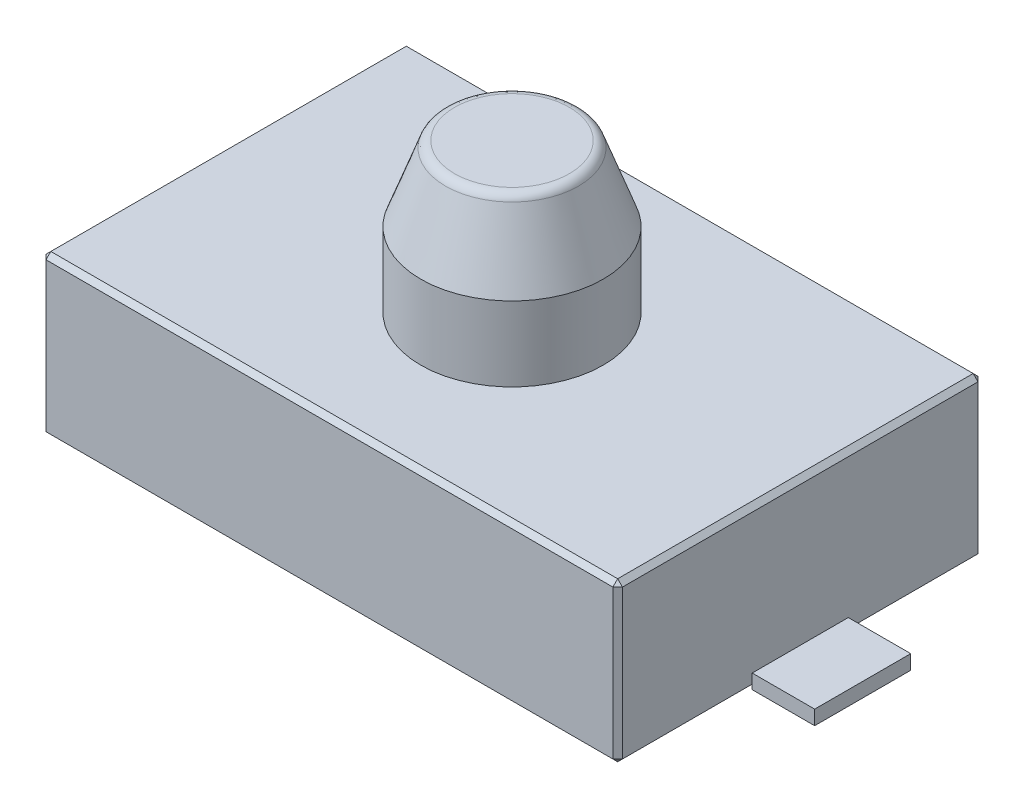
ISO-10303-21;
HEADER;
FILE_DESCRIPTION(('STEP AP214'),'2;1');
FILE_NAME('part.step','',(''),(''),'','','');
FILE_SCHEMA(('AUTOMOTIVE_DESIGN { 1 0 10303 214 1 1 1 1 }'));
ENDSEC;
DATA;
#1=APPLICATION_CONTEXT('core data for automotive mechanical design processes');
#2=APPLICATION_PROTOCOL_DEFINITION('international standard','automotive_design',2000,#1);
#3=PRODUCT_CONTEXT('',#1,'mechanical');
#4=PRODUCT('Part','Part','',(#3));
#5=PRODUCT_RELATED_PRODUCT_CATEGORY('part','',(#4));
#6=PRODUCT_DEFINITION_FORMATION('','',#4);
#7=PRODUCT_DEFINITION_CONTEXT('part definition',#1,'design');
#8=PRODUCT_DEFINITION('design','',#6,#7);
#9=PRODUCT_DEFINITION_SHAPE('','',#8);
#10=(LENGTH_UNIT() NAMED_UNIT(*) SI_UNIT(.MILLI.,.METRE.));
#11=(NAMED_UNIT(*) PLANE_ANGLE_UNIT() SI_UNIT($,.RADIAN.));
#12=(NAMED_UNIT(*) SI_UNIT($,.STERADIAN.) SOLID_ANGLE_UNIT());
#13=UNCERTAINTY_MEASURE_WITH_UNIT(LENGTH_MEASURE(1.E-05),#10,'distance_accuracy_value','');
#14=(GEOMETRIC_REPRESENTATION_CONTEXT(3) GLOBAL_UNCERTAINTY_ASSIGNED_CONTEXT((#13)) GLOBAL_UNIT_ASSIGNED_CONTEXT((#10,
#11,#12)) REPRESENTATION_CONTEXT('',''));
#15=CARTESIAN_POINT('',(0.,0.,0.));
#16=DIRECTION('',(0.,0.,1.));
#17=DIRECTION('',(1.,0.,0.));
#18=AXIS2_PLACEMENT_3D('',#15,#16,#17);
#19=CARTESIAN_POINT('',(-1.54994083130457,2.425,1.67597402597403));
#20=DIRECTION('',(0.,-1.,0.));
#21=DIRECTION('',(0.,0.,-1.));
#22=AXIS2_PLACEMENT_3D('',#19,#20,#21);
#23=CYLINDRICAL_SURFACE('',#22,0.95);
#24=CARTESIAN_POINT('',(-1.54994083130457,2.425,1.67597402597403));
#25=DIRECTION('',(0.,1.,0.));
#26=DIRECTION('',(0.,0.,1.));
#27=AXIS2_PLACEMENT_3D('',#24,#25,#26);
#28=CIRCLE('',#27,0.95);
#29=CARTESIAN_POINT('',(-1.54994083130457,2.425,0.725974025974026));
#30=VERTEX_POINT('',#29);
#31=EDGE_CURVE('E72',#30,#30,#28,.T.);
#32=CARTESIAN_POINT('',(-1.54994083130457,1.65,1.67597402597403));
#33=DIRECTION('',(0.,1.,0.));
#34=DIRECTION('',(0.,0.,1.));
#35=AXIS2_PLACEMENT_3D('',#32,#33,#34);
#36=CIRCLE('',#35,0.95);
#37=CARTESIAN_POINT('',(-1.54994083130457,1.65,0.725974025974026));
#38=VERTEX_POINT('',#37);
#39=EDGE_CURVE('E76',#38,#38,#36,.T.);
#40=CARTESIAN_POINT('',(-1.54994083130457,2.425,0.725974025974026));
#41=CARTESIAN_POINT('',(-1.54994083130457,2.41692708333333,0.725974025974026));
#42=CARTESIAN_POINT('',(-1.54994083130457,2.40885416666667,0.725974025974026));
#43=CARTESIAN_POINT('',(-1.54994083130457,2.39270833333333,0.725974025974026));
#44=CARTESIAN_POINT('',(-1.54994083130457,2.38463541666667,0.725974025974026));
#45=CARTESIAN_POINT('',(-1.54994083130457,2.36848958333333,0.725974025974026));
#46=CARTESIAN_POINT('',(-1.54994083130457,2.36041666666667,0.725974025974026));
#47=CARTESIAN_POINT('',(-1.54994083130457,2.34427083333333,0.725974025974026));
#48=CARTESIAN_POINT('',(-1.54994083130457,2.33619791666667,0.725974025974026));
#49=CARTESIAN_POINT('',(-1.54994083130457,2.32005208333333,0.725974025974026));
#50=CARTESIAN_POINT('',(-1.54994083130457,2.31197916666667,0.725974025974026));
#51=CARTESIAN_POINT('',(-1.54994083130457,2.29583333333333,0.725974025974026));
#52=CARTESIAN_POINT('',(-1.54994083130457,2.28776041666667,0.725974025974026));
#53=CARTESIAN_POINT('',(-1.54994083130457,2.27161458333333,0.725974025974026));
#54=CARTESIAN_POINT('',(-1.54994083130457,2.26354166666667,0.725974025974026));
#55=CARTESIAN_POINT('',(-1.54994083130457,2.24739583333333,0.725974025974026));
#56=CARTESIAN_POINT('',(-1.54994083130457,2.23932291666667,0.725974025974026));
#57=CARTESIAN_POINT('',(-1.54994083130457,2.22317708333333,0.725974025974026));
#58=CARTESIAN_POINT('',(-1.54994083130457,2.21510416666667,0.725974025974026));
#59=CARTESIAN_POINT('',(-1.54994083130457,2.19895833333333,0.725974025974026));
#60=CARTESIAN_POINT('',(-1.54994083130457,2.19088541666667,0.725974025974026));
#61=CARTESIAN_POINT('',(-1.54994083130457,2.17473958333333,0.725974025974026));
#62=CARTESIAN_POINT('',(-1.54994083130457,2.16666666666667,0.725974025974026));
#63=CARTESIAN_POINT('',(-1.54994083130457,2.15052083333333,0.725974025974026));
#64=CARTESIAN_POINT('',(-1.54994083130457,2.14244791666667,0.725974025974026));
#65=CARTESIAN_POINT('',(-1.54994083130457,2.12630208333333,0.725974025974026));
#66=CARTESIAN_POINT('',(-1.54994083130457,2.11822916666667,0.725974025974026));
#67=CARTESIAN_POINT('',(-1.54994083130457,2.10208333333333,0.725974025974026));
#68=CARTESIAN_POINT('',(-1.54994083130457,2.09401041666667,0.725974025974026));
#69=CARTESIAN_POINT('',(-1.54994083130457,2.07786458333333,0.725974025974026));
#70=CARTESIAN_POINT('',(-1.54994083130457,2.06979166666667,0.725974025974026));
#71=CARTESIAN_POINT('',(-1.54994083130457,2.05364583333333,0.725974025974026));
#72=CARTESIAN_POINT('',(-1.54994083130457,2.04557291666667,0.725974025974026));
#73=CARTESIAN_POINT('',(-1.54994083130457,2.02942708333333,0.725974025974026));
#74=CARTESIAN_POINT('',(-1.54994083130457,2.02135416666667,0.725974025974026));
#75=CARTESIAN_POINT('',(-1.54994083130457,2.00520833333333,0.725974025974026));
#76=CARTESIAN_POINT('',(-1.54994083130457,1.99713541666667,0.725974025974026));
#77=CARTESIAN_POINT('',(-1.54994083130457,1.98098958333333,0.725974025974026));
#78=CARTESIAN_POINT('',(-1.54994083130457,1.97291666666667,0.725974025974026));
#79=CARTESIAN_POINT('',(-1.54994083130457,1.95677083333333,0.725974025974026));
#80=CARTESIAN_POINT('',(-1.54994083130457,1.94869791666667,0.725974025974026));
#81=CARTESIAN_POINT('',(-1.54994083130457,1.93255208333333,0.725974025974026));
#82=CARTESIAN_POINT('',(-1.54994083130457,1.92447916666667,0.725974025974026));
#83=CARTESIAN_POINT('',(-1.54994083130457,1.90833333333333,0.725974025974026));
#84=CARTESIAN_POINT('',(-1.54994083130457,1.90026041666667,0.725974025974026));
#85=CARTESIAN_POINT('',(-1.54994083130457,1.88411458333333,0.725974025974026));
#86=CARTESIAN_POINT('',(-1.54994083130457,1.87604166666667,0.725974025974026));
#87=CARTESIAN_POINT('',(-1.54994083130457,1.85989583333333,0.725974025974026));
#88=CARTESIAN_POINT('',(-1.54994083130457,1.85182291666667,0.725974025974026));
#89=CARTESIAN_POINT('',(-1.54994083130457,1.83567708333333,0.725974025974026));
#90=CARTESIAN_POINT('',(-1.54994083130457,1.82760416666667,0.725974025974026));
#91=CARTESIAN_POINT('',(-1.54994083130457,1.81145833333333,0.725974025974026));
#92=CARTESIAN_POINT('',(-1.54994083130457,1.80338541666667,0.725974025974026));
#93=CARTESIAN_POINT('',(-1.54994083130457,1.78723958333333,0.725974025974026));
#94=CARTESIAN_POINT('',(-1.54994083130457,1.77916666666667,0.725974025974026));
#95=CARTESIAN_POINT('',(-1.54994083130457,1.76302083333333,0.725974025974026));
#96=CARTESIAN_POINT('',(-1.54994083130457,1.75494791666667,0.725974025974026));
#97=CARTESIAN_POINT('',(-1.54994083130457,1.73880208333333,0.725974025974026));
#98=CARTESIAN_POINT('',(-1.54994083130457,1.73072916666667,0.725974025974026));
#99=CARTESIAN_POINT('',(-1.54994083130457,1.71458333333333,0.725974025974026));
#100=CARTESIAN_POINT('',(-1.54994083130457,1.70651041666667,0.725974025974026));
#101=CARTESIAN_POINT('',(-1.54994083130457,1.69036458333333,0.725974025974026));
#102=CARTESIAN_POINT('',(-1.54994083130457,1.68229166666667,0.725974025974026));
#103=CARTESIAN_POINT('',(-1.54994083130457,1.66614583333333,0.725974025974026));
#104=CARTESIAN_POINT('',(-1.54994083130457,1.65807291666667,0.725974025974026));
#105=CARTESIAN_POINT('',(-1.54994083130457,1.65,0.725974025974026));
#106=B_SPLINE_CURVE_WITH_KNOTS('',3,(#40,#41,#42,#43,#44,#45,#46,#47,#48,#49,#50,#51,#52,#53,
#54,#55,#56,#57,#58,#59,#60,#61,#62,#63,#64,#65,#66,#67,#68,#69,#70,#71,#72,#73,#74,#75,#76,#77,
#78,#79,#80,#81,#82,#83,#84,#85,#86,#87,#88,#89,#90,#91,#92,#93,#94,#95,#96,#97,#98,#99,#100,
#101,#102,#103,#104,#105),.UNSPECIFIED.,.F.,.F.,(4,2,2,2,2,2,2,2,2,2,2,2,2,2,2,2,2,2,2,2,2,2,2,
2,2,2,2,2,2,2,2,2,4),(0.,0.0242187500000004,0.0484375000000003,0.0726562500000002,
0.0968750000000002,0.12109375,0.1453125,0.16953125,0.19375,0.21796875,0.2421875,0.26640625,
0.290625,0.31484375,0.3390625,0.36328125,0.3875,0.41171875,0.4359375,0.46015625,0.484375,
0.50859375,0.5328125,0.55703125,0.58125,0.60546875,0.6296875,0.65390625,0.678125,0.70234375,
0.7265625,0.75078125,0.775),.UNSPECIFIED.);
#107=EDGE_CURVE('BSEAM57',#30,#38,#106,.T.);
#108=ORIENTED_EDGE('',*,*,#31,.F.);
#109=ORIENTED_EDGE('',*,*,#39,.T.);
#110=ORIENTED_EDGE('',*,*,#107,.T.);
#111=ORIENTED_EDGE('',*,*,#107,.F.);
#112=EDGE_LOOP('',(#108,#110,#109,#111));
#113=FACE_BOUND('',#112,.T.);
#114=ADVANCED_FACE('F57',(#113),#23,.T.);
#115=CARTESIAN_POINT('',(-1.54994083130457,1.65,1.67597402597403));
#116=DIRECTION('',(0.,1.,0.));
#117=DIRECTION('',(0.,0.,1.));
#118=AXIS2_PLACEMENT_3D('',#115,#116,#117);
#119=PLANE('',#118);
#120=ORIENTED_EDGE('',*,*,#39,.F.);
#121=EDGE_LOOP('',(#120));
#122=FACE_BOUND('',#121,.T.);
#123=ADVANCED_FACE('F83',(#122),#119,.F.);
#124=CARTESIAN_POINT('',(-1.54994083130457,2.425,1.67597402597403));
#125=DIRECTION('',(0.,-1.,0.));
#126=DIRECTION('',(0.,0.,1.));
#127=AXIS2_PLACEMENT_3D('',#124,#125,#126);
#128=CONICAL_SURFACE('',#127,0.95,0.349065850398867);
#129=CARTESIAN_POINT('',(-1.54994083130457,3.13420201433257,1.67597402597403));
#130=DIRECTION('',(0.,-1.,0.));
#131=DIRECTION('',(0.,0.,-1.));
#132=AXIS2_PLACEMENT_3D('',#129,#130,#131);
#133=CIRCLE('',#132,0.691871576701312);
#134=CARTESIAN_POINT('',(-1.54994083130457,3.13420201433257,0.984102449272714));
#135=VERTEX_POINT('',#134);
#136=EDGE_CURVE('E11',#135,#135,#133,.T.);
#137=ORIENTED_EDGE('',*,*,#136,.T.);
#138=EDGE_LOOP('',(#137));
#139=FACE_BOUND('',#138,.T.);
#140=ORIENTED_EDGE('',*,*,#31,.T.);
#141=EDGE_LOOP('',(#140));
#142=FACE_BOUND('',#141,.T.);
#143=ADVANCED_FACE('F85',(#139,#142),#128,.T.);
#144=CARTESIAN_POINT('',(-1.54994083130457,3.2,1.67597402597403));
#145=DIRECTION('',(0.,1.,0.));
#146=DIRECTION('',(0.,0.,1.));
#147=AXIS2_PLACEMENT_3D('',#144,#145,#146);
#148=PLANE('',#147);
#149=CARTESIAN_POINT('',(-1.54994083130457,3.2,1.67597402597403));
#150=DIRECTION('',(0.,1.,0.));
#151=DIRECTION('',(0.,0.,1.));
#152=AXIS2_PLACEMENT_3D('',#149,#150,#151);
#153=CIRCLE('',#152,0.597902314622721);
#154=CARTESIAN_POINT('',(-1.54994083130457,3.2,2.27387634059675));
#155=VERTEX_POINT('',#154);
#156=EDGE_CURVE('E65',#155,#155,#153,.T.);
#157=ORIENTED_EDGE('',*,*,#156,.T.);
#158=EDGE_LOOP('',(#157));
#159=FACE_BOUND('',#158,.T.);
#160=ADVANCED_FACE('F91',(#159),#148,.T.);
#161=CARTESIAN_POINT('',(-1.54994083130457,3.1,1.67597402597403));
#162=DIRECTION('',(0.,1.,0.));
#163=DIRECTION('',(0.,0.,1.));
#164=AXIS2_PLACEMENT_3D('',#161,#162,#163);
#165=TOROIDAL_SURFACE('',#164,0.597902314622721,0.1);
#166=ORIENTED_EDGE('',*,*,#136,.F.);
#167=EDGE_LOOP('',(#166));
#168=FACE_BOUND('',#167,.T.);
#169=ORIENTED_EDGE('',*,*,#156,.F.);
#170=EDGE_LOOP('',(#169));
#171=FACE_BOUND('',#170,.T.);
#172=ADVANCED_FACE('F59',(#168,#171),#165,.T.);
#173=CLOSED_SHELL('',(#114,#123,#143,#160,#172));
#174=MANIFOLD_SOLID_BREP('B2',#173);
#175=CARTESIAN_POINT('',(-4.54994083130457,0.15,1.17597402597403));
#176=DIRECTION('',(1.,0.,0.));
#177=DIRECTION('',(0.,0.,-1.));
#178=AXIS2_PLACEMENT_3D('',#175,#176,#177);
#179=PLANE('',#178);
#180=DIRECTION('',(0.,0.,1.));
#181=VECTOR('',#180,1.);
#182=CARTESIAN_POINT('',(-4.54994083130457,0.,1.17597402597403));
#183=LINE('',#182,#181);
#184=CARTESIAN_POINT('',(-4.54994083130457,0.,1.17597402597403));
#185=VERTEX_POINT('',#184);
#186=CARTESIAN_POINT('',(-4.54994083130457,0.,2.17597402597403));
#187=VERTEX_POINT('',#186);
#188=EDGE_CURVE('E55',#185,#187,#183,.T.);
#189=ORIENTED_EDGE('',*,*,#188,.F.);
#190=DIRECTION('',(0.,-1.,0.));
#191=VECTOR('',#190,1.);
#192=CARTESIAN_POINT('',(-4.54994083130457,0.15,1.17597402597403));
#193=LINE('',#192,#191);
#194=CARTESIAN_POINT('',(-4.54994083130457,0.15,1.17597402597403));
#195=VERTEX_POINT('',#194);
#196=EDGE_CURVE('E193',#195,#185,#193,.T.);
#197=ORIENTED_EDGE('',*,*,#196,.F.);
#198=DIRECTION('',(0.,0.,1.));
#199=VECTOR('',#198,1.);
#200=CARTESIAN_POINT('',(-4.54994083130457,0.15,1.17597402597403));
#201=LINE('',#200,#199);
#202=CARTESIAN_POINT('',(-4.54994083130457,0.15,2.17597402597403));
#203=VERTEX_POINT('',#202);
#204=EDGE_CURVE('E150',#195,#203,#201,.T.);
#205=ORIENTED_EDGE('',*,*,#204,.T.);
#206=DIRECTION('',(0.,-1.,0.));
#207=VECTOR('',#206,1.);
#208=CARTESIAN_POINT('',(-4.54994083130457,0.15,2.17597402597403));
#209=LINE('',#208,#207);
#210=EDGE_CURVE('E166',#203,#187,#209,.T.);
#211=ORIENTED_EDGE('',*,*,#210,.T.);
#212=EDGE_LOOP('',(#189,#197,#205,#211));
#213=FACE_BOUND('',#212,.T.);
#214=ADVANCED_FACE('F146',(#213),#179,.T.);
#215=CARTESIAN_POINT('',(-4.54994083130457,0.15,1.17597402597403));
#216=DIRECTION('',(0.,0.,1.));
#217=DIRECTION('',(1.,0.,0.));
#218=AXIS2_PLACEMENT_3D('',#215,#216,#217);
#219=PLANE('',#218);
#220=DIRECTION('',(-1.,0.,0.));
#221=VECTOR('',#220,1.);
#222=CARTESIAN_POINT('',(-4.54994083130457,0.,1.17597402597403));
#223=LINE('',#222,#221);
#224=CARTESIAN_POINT('',(-5.19994083130457,0.,1.17597402597403));
#225=VERTEX_POINT('',#224);
#226=EDGE_CURVE('E196',#185,#225,#223,.T.);
#227=ORIENTED_EDGE('',*,*,#226,.T.);
#228=DIRECTION('',(0.,-1.,0.));
#229=VECTOR('',#228,1.);
#230=CARTESIAN_POINT('',(-5.19994083130457,0.15,1.17597402597403));
#231=LINE('',#230,#229);
#232=CARTESIAN_POINT('',(-5.19994083130457,0.15,1.17597402597403));
#233=VERTEX_POINT('',#232);
#234=EDGE_CURVE('E199',#233,#225,#231,.T.);
#235=ORIENTED_EDGE('',*,*,#234,.F.);
#236=DIRECTION('',(-1.,0.,0.));
#237=VECTOR('',#236,1.);
#238=CARTESIAN_POINT('',(-4.54994083130457,0.15,1.17597402597403));
#239=LINE('',#238,#237);
#240=EDGE_CURVE('E221',#195,#233,#239,.T.);
#241=ORIENTED_EDGE('',*,*,#240,.F.);
#242=ORIENTED_EDGE('',*,*,#196,.T.);
#243=EDGE_LOOP('',(#227,#235,#241,#242));
#244=FACE_BOUND('',#243,.T.);
#245=ADVANCED_FACE('F198',(#244),#219,.F.);
#246=CARTESIAN_POINT('',(-5.19994083130457,0.15,1.17597402597403));
#247=DIRECTION('',(1.,0.,0.));
#248=DIRECTION('',(0.,0.,-1.));
#249=AXIS2_PLACEMENT_3D('',#246,#247,#248);
#250=PLANE('',#249);
#251=DIRECTION('',(0.,0.,1.));
#252=VECTOR('',#251,1.);
#253=CARTESIAN_POINT('',(-5.19994083130457,0.,1.17597402597403));
#254=LINE('',#253,#252);
#255=CARTESIAN_POINT('',(-5.19994083130457,0.,2.17597402597403));
#256=VERTEX_POINT('',#255);
#257=EDGE_CURVE('E203',#225,#256,#254,.T.);
#258=ORIENTED_EDGE('',*,*,#257,.T.);
#259=DIRECTION('',(0.,-1.,0.));
#260=VECTOR('',#259,1.);
#261=CARTESIAN_POINT('',(-5.19994083130457,0.15,2.17597402597403));
#262=LINE('',#261,#260);
#263=CARTESIAN_POINT('',(-5.19994083130457,0.15,2.17597402597403));
#264=VERTEX_POINT('',#263);
#265=EDGE_CURVE('E210',#264,#256,#262,.T.);
#266=ORIENTED_EDGE('',*,*,#265,.F.);
#267=DIRECTION('',(0.,0.,1.));
#268=VECTOR('',#267,1.);
#269=CARTESIAN_POINT('',(-5.19994083130457,0.15,1.17597402597403));
#270=LINE('',#269,#268);
#271=EDGE_CURVE('E183',#233,#264,#270,.T.);
#272=ORIENTED_EDGE('',*,*,#271,.F.);
#273=ORIENTED_EDGE('',*,*,#234,.T.);
#274=EDGE_LOOP('',(#258,#266,#272,#273));
#275=FACE_BOUND('',#274,.T.);
#276=ADVANCED_FACE('F207',(#275),#250,.F.);
#277=CARTESIAN_POINT('',(-4.54994083130457,0.15,2.17597402597403));
#278=DIRECTION('',(0.,0.,1.));
#279=DIRECTION('',(1.,0.,0.));
#280=AXIS2_PLACEMENT_3D('',#277,#278,#279);
#281=PLANE('',#280);
#282=DIRECTION('',(-1.,0.,0.));
#283=VECTOR('',#282,1.);
#284=CARTESIAN_POINT('',(-4.54994083130457,0.,2.17597402597403));
#285=LINE('',#284,#283);
#286=EDGE_CURVE('E157',#187,#256,#285,.T.);
#287=ORIENTED_EDGE('',*,*,#286,.F.);
#288=ORIENTED_EDGE('',*,*,#210,.F.);
#289=DIRECTION('',(-1.,0.,0.));
#290=VECTOR('',#289,1.);
#291=CARTESIAN_POINT('',(-4.54994083130457,0.15,2.17597402597403));
#292=LINE('',#291,#290);
#293=EDGE_CURVE('E225',#203,#264,#292,.T.);
#294=ORIENTED_EDGE('',*,*,#293,.T.);
#295=ORIENTED_EDGE('',*,*,#265,.T.);
#296=EDGE_LOOP('',(#287,#288,#294,#295));
#297=FACE_BOUND('',#296,.T.);
#298=ADVANCED_FACE('F230',(#297),#281,.T.);
#299=CARTESIAN_POINT('',(0.,0.15,0.));
#300=DIRECTION('',(0.,-1.,0.));
#301=DIRECTION('',(0.,0.,-1.));
#302=AXIS2_PLACEMENT_3D('',#299,#300,#301);
#303=PLANE('',#302);
#304=ORIENTED_EDGE('',*,*,#204,.F.);
#305=ORIENTED_EDGE('',*,*,#240,.T.);
#306=ORIENTED_EDGE('',*,*,#271,.T.);
#307=ORIENTED_EDGE('',*,*,#293,.F.);
#308=EDGE_LOOP('',(#304,#305,#306,#307));
#309=FACE_BOUND('',#308,.T.);
#310=ADVANCED_FACE('F148',(#309),#303,.F.);
#311=CARTESIAN_POINT('',(0.,0.,0.));
#312=DIRECTION('',(0.,-1.,0.));
#313=DIRECTION('',(0.,0.,-1.));
#314=AXIS2_PLACEMENT_3D('',#311,#312,#313);
#315=PLANE('',#314);
#316=ORIENTED_EDGE('',*,*,#188,.T.);
#317=ORIENTED_EDGE('',*,*,#286,.T.);
#318=ORIENTED_EDGE('',*,*,#257,.F.);
#319=ORIENTED_EDGE('',*,*,#226,.F.);
#320=EDGE_LOOP('',(#316,#317,#318,#319));
#321=FACE_BOUND('',#320,.T.);
#322=ADVANCED_FACE('F212',(#321),#315,.T.);
#323=CLOSED_SHELL('',(#214,#245,#276,#298,#310,#322));
#324=MANIFOLD_SOLID_BREP('B6',#323);
#325=CARTESIAN_POINT('',(1.45005916869543,0.15,1.17597402597403));
#326=DIRECTION('',(1.,0.,0.));
#327=DIRECTION('',(0.,0.,-1.));
#328=AXIS2_PLACEMENT_3D('',#325,#326,#327);
#329=PLANE('',#328);
#330=DIRECTION('',(0.,0.,1.));
#331=VECTOR('',#330,1.);
#332=CARTESIAN_POINT('',(1.45005916869543,0.,1.17597402597403));
#333=LINE('',#332,#331);
#334=CARTESIAN_POINT('',(1.45005916869543,0.,1.17597402597403));
#335=VERTEX_POINT('',#334);
#336=CARTESIAN_POINT('',(1.45005916869543,0.,2.17597402597403));
#337=VERTEX_POINT('',#336);
#338=EDGE_CURVE('E365',#335,#337,#333,.T.);
#339=ORIENTED_EDGE('',*,*,#338,.T.);
#340=DIRECTION('',(0.,-1.,0.));
#341=VECTOR('',#340,1.);
#342=CARTESIAN_POINT('',(1.45005916869543,0.15,2.17597402597403));
#343=LINE('',#342,#341);
#344=CARTESIAN_POINT('',(1.45005916869543,0.15,2.17597402597403));
#345=VERTEX_POINT('',#344);
#346=EDGE_CURVE('E144',#345,#337,#343,.T.);
#347=ORIENTED_EDGE('',*,*,#346,.F.);
#348=DIRECTION('',(0.,0.,1.));
#349=VECTOR('',#348,1.);
#350=CARTESIAN_POINT('',(1.45005916869543,0.15,1.17597402597403));
#351=LINE('',#350,#349);
#352=CARTESIAN_POINT('',(1.45005916869543,0.15,1.17597402597403));
#353=VERTEX_POINT('',#352);
#354=EDGE_CURVE('E346',#353,#345,#351,.T.);
#355=ORIENTED_EDGE('',*,*,#354,.F.);
#356=DIRECTION('',(0.,-1.,0.));
#357=VECTOR('',#356,1.);
#358=CARTESIAN_POINT('',(1.45005916869543,0.15,1.17597402597403));
#359=LINE('',#358,#357);
#360=EDGE_CURVE('E313',#353,#335,#359,.T.);
#361=ORIENTED_EDGE('',*,*,#360,.T.);
#362=EDGE_LOOP('',(#339,#347,#355,#361));
#363=FACE_BOUND('',#362,.T.);
#364=ADVANCED_FACE('F296',(#363),#329,.F.);
#365=CARTESIAN_POINT('',(1.45005916869543,0.15,2.17597402597403));
#366=DIRECTION('',(0.,0.,-1.));
#367=DIRECTION('',(-1.,0.,0.));
#368=AXIS2_PLACEMENT_3D('',#365,#366,#367);
#369=PLANE('',#368);
#370=DIRECTION('',(1.,0.,0.));
#371=VECTOR('',#370,1.);
#372=CARTESIAN_POINT('',(1.45005916869543,0.,2.17597402597403));
#373=LINE('',#372,#371);
#374=CARTESIAN_POINT('',(2.10005916869543,0.,2.17597402597403));
#375=VERTEX_POINT('',#374);
#376=EDGE_CURVE('E352',#337,#375,#373,.T.);
#377=ORIENTED_EDGE('',*,*,#376,.T.);
#378=DIRECTION('',(0.,-1.,0.));
#379=VECTOR('',#378,1.);
#380=CARTESIAN_POINT('',(2.10005916869543,0.15,2.17597402597403));
#381=LINE('',#380,#379);
#382=CARTESIAN_POINT('',(2.10005916869543,0.15,2.17597402597403));
#383=VERTEX_POINT('',#382);
#384=EDGE_CURVE('E305',#383,#375,#381,.T.);
#385=ORIENTED_EDGE('',*,*,#384,.F.);
#386=DIRECTION('',(1.,0.,0.));
#387=VECTOR('',#386,1.);
#388=CARTESIAN_POINT('',(1.45005916869543,0.15,2.17597402597403));
#389=LINE('',#388,#387);
#390=EDGE_CURVE('E338',#345,#383,#389,.T.);
#391=ORIENTED_EDGE('',*,*,#390,.F.);
#392=ORIENTED_EDGE('',*,*,#346,.T.);
#393=EDGE_LOOP('',(#377,#385,#391,#392));
#394=FACE_BOUND('',#393,.T.);
#395=ADVANCED_FACE('F351',(#394),#369,.F.);
#396=CARTESIAN_POINT('',(2.10005916869543,0.15,1.17597402597403));
#397=DIRECTION('',(1.,0.,0.));
#398=DIRECTION('',(0.,0.,-1.));
#399=AXIS2_PLACEMENT_3D('',#396,#397,#398);
#400=PLANE('',#399);
#401=DIRECTION('',(0.,0.,1.));
#402=VECTOR('',#401,1.);
#403=CARTESIAN_POINT('',(2.10005916869543,0.,1.17597402597403));
#404=LINE('',#403,#402);
#405=CARTESIAN_POINT('',(2.10005916869543,0.,1.17597402597403));
#406=VERTEX_POINT('',#405);
#407=EDGE_CURVE('E369',#406,#375,#404,.T.);
#408=ORIENTED_EDGE('',*,*,#407,.F.);
#409=DIRECTION('',(0.,-1.,0.));
#410=VECTOR('',#409,1.);
#411=CARTESIAN_POINT('',(2.10005916869543,0.15,1.17597402597403));
#412=LINE('',#411,#410);
#413=CARTESIAN_POINT('',(2.10005916869543,0.15,1.17597402597403));
#414=VERTEX_POINT('',#413);
#415=EDGE_CURVE('E327',#414,#406,#412,.T.);
#416=ORIENTED_EDGE('',*,*,#415,.F.);
#417=DIRECTION('',(0.,0.,1.));
#418=VECTOR('',#417,1.);
#419=CARTESIAN_POINT('',(2.10005916869543,0.15,1.17597402597403));
#420=LINE('',#419,#418);
#421=EDGE_CURVE('E345',#414,#383,#420,.T.);
#422=ORIENTED_EDGE('',*,*,#421,.T.);
#423=ORIENTED_EDGE('',*,*,#384,.T.);
#424=EDGE_LOOP('',(#408,#416,#422,#423));
#425=FACE_BOUND('',#424,.T.);
#426=ADVANCED_FACE('F356',(#425),#400,.T.);
#427=CARTESIAN_POINT('',(1.45005916869543,0.15,1.17597402597403));
#428=DIRECTION('',(0.,0.,-1.));
#429=DIRECTION('',(-1.,0.,0.));
#430=AXIS2_PLACEMENT_3D('',#427,#428,#429);
#431=PLANE('',#430);
#432=DIRECTION('',(1.,0.,0.));
#433=VECTOR('',#432,1.);
#434=CARTESIAN_POINT('',(1.45005916869543,0.,1.17597402597403));
#435=LINE('',#434,#433);
#436=EDGE_CURVE('E372',#335,#406,#435,.T.);
#437=ORIENTED_EDGE('',*,*,#436,.F.);
#438=ORIENTED_EDGE('',*,*,#360,.F.);
#439=DIRECTION('',(1.,0.,0.));
#440=VECTOR('',#439,1.);
#441=CARTESIAN_POINT('',(1.45005916869543,0.15,1.17597402597403));
#442=LINE('',#441,#440);
#443=EDGE_CURVE('E358',#353,#414,#442,.T.);
#444=ORIENTED_EDGE('',*,*,#443,.T.);
#445=ORIENTED_EDGE('',*,*,#415,.T.);
#446=EDGE_LOOP('',(#437,#438,#444,#445));
#447=FACE_BOUND('',#446,.T.);
#448=ADVANCED_FACE('F382',(#447),#431,.T.);
#449=CARTESIAN_POINT('',(0.,0.15,0.));
#450=DIRECTION('',(0.,1.,0.));
#451=DIRECTION('',(0.,0.,1.));
#452=AXIS2_PLACEMENT_3D('',#449,#450,#451);
#453=PLANE('',#452);
#454=ORIENTED_EDGE('',*,*,#354,.T.);
#455=ORIENTED_EDGE('',*,*,#390,.T.);
#456=ORIENTED_EDGE('',*,*,#421,.F.);
#457=ORIENTED_EDGE('',*,*,#443,.F.);
#458=EDGE_LOOP('',(#454,#455,#456,#457));
#459=FACE_BOUND('',#458,.T.);
#460=ADVANCED_FACE('F342',(#459),#453,.T.);
#461=CARTESIAN_POINT('',(0.,0.,0.));
#462=DIRECTION('',(0.,1.,0.));
#463=DIRECTION('',(0.,0.,1.));
#464=AXIS2_PLACEMENT_3D('',#461,#462,#463);
#465=PLANE('',#464);
#466=ORIENTED_EDGE('',*,*,#338,.F.);
#467=ORIENTED_EDGE('',*,*,#436,.T.);
#468=ORIENTED_EDGE('',*,*,#407,.T.);
#469=ORIENTED_EDGE('',*,*,#376,.F.);
#470=EDGE_LOOP('',(#466,#467,#468,#469));
#471=FACE_BOUND('',#470,.T.);
#472=ADVANCED_FACE('F381',(#471),#465,.F.);
#473=CLOSED_SHELL('',(#364,#395,#426,#448,#460,#472));
#474=MANIFOLD_SOLID_BREP('B49',#473);
#475=CARTESIAN_POINT('',(-4.54994083130457,1.65,3.57597402597403));
#476=DIRECTION('',(-1.,0.,0.));
#477=DIRECTION('',(0.,0.,1.));
#478=AXIS2_PLACEMENT_3D('',#475,#476,#477);
#479=PLANE('',#478);
#480=DIRECTION('',(0.,-1.,0.));
#481=VECTOR('',#480,1.);
#482=CARTESIAN_POINT('',(-4.54994083130457,1.65,-0.174025974025974));
#483=LINE('',#482,#481);
#484=CARTESIAN_POINT('',(-4.54994083130457,1.6,-0.174025974025974));
#485=VERTEX_POINT('',#484);
#486=CARTESIAN_POINT('',(-4.54994083130457,0.0500000000000006,-0.174025974025974));
#487=VERTEX_POINT('',#486);
#488=EDGE_CURVE('E719',#485,#487,#483,.T.);
#489=ORIENTED_EDGE('',*,*,#488,.T.);
#490=DIRECTION('',(0.,0.,1.));
#491=VECTOR('',#490,1.);
#492=CARTESIAN_POINT('',(-4.54994083130457,0.0500000000000006,3.57597402597403));
#493=LINE('',#492,#491);
#494=CARTESIAN_POINT('',(-4.54994083130457,0.0500000000000006,3.52597402597403));
#495=VERTEX_POINT('',#494);
#496=EDGE_CURVE('E722',#487,#495,#493,.T.);
#497=ORIENTED_EDGE('',*,*,#496,.T.);
#498=DIRECTION('',(0.,1.,0.));
#499=VECTOR('',#498,1.);
#500=CARTESIAN_POINT('',(-4.54994083130457,1.65,3.52597402597403));
#501=LINE('',#500,#499);
#502=CARTESIAN_POINT('',(-4.54994083130457,1.6,3.52597402597403));
#503=VERTEX_POINT('',#502);
#504=EDGE_CURVE('E642',#495,#503,#501,.T.);
#505=ORIENTED_EDGE('',*,*,#504,.T.);
#506=DIRECTION('',(0.,0.,-1.));
#507=VECTOR('',#506,1.);
#508=CARTESIAN_POINT('',(-4.54994083130457,1.6,-0.224025974025974));
#509=LINE('',#508,#507);
#510=EDGE_CURVE('E710',#503,#485,#509,.T.);
#511=ORIENTED_EDGE('',*,*,#510,.T.);
#512=EDGE_LOOP('',(#489,#497,#505,#511));
#513=FACE_BOUND('',#512,.T.);
#514=ADVANCED_FACE('F437',(#513),#479,.T.);
#515=CARTESIAN_POINT('',(-4.54994083130457,1.65,3.57597402597403));
#516=DIRECTION('',(0.,0.,-1.));
#517=DIRECTION('',(-1.,0.,0.));
#518=AXIS2_PLACEMENT_3D('',#515,#516,#517);
#519=PLANE('',#518);
#520=DIRECTION('',(-1.,0.,0.));
#521=VECTOR('',#520,1.);
#522=CARTESIAN_POINT('',(-4.54994083130457,1.6,3.57597402597403));
#523=LINE('',#522,#521);
#524=CARTESIAN_POINT('',(1.40005916869543,1.6,3.57597402597403));
#525=VERTEX_POINT('',#524);
#526=CARTESIAN_POINT('',(-4.49994083130457,1.6,3.57597402597403));
#527=VERTEX_POINT('',#526);
#528=EDGE_CURVE('E736',#525,#527,#523,.T.);
#529=ORIENTED_EDGE('',*,*,#528,.T.);
#530=DIRECTION('',(0.,-1.,0.));
#531=VECTOR('',#530,1.);
#532=CARTESIAN_POINT('',(-4.49994083130457,0.,3.57597402597403));
#533=LINE('',#532,#531);
#534=CARTESIAN_POINT('',(-4.49994083130457,0.0500000000000006,3.57597402597403));
#535=VERTEX_POINT('',#534);
#536=EDGE_CURVE('E645',#527,#535,#533,.T.);
#537=ORIENTED_EDGE('',*,*,#536,.T.);
#538=DIRECTION('',(1.,0.,0.));
#539=VECTOR('',#538,1.);
#540=CARTESIAN_POINT('',(1.45005916869543,0.0500000000000006,3.57597402597403));
#541=LINE('',#540,#539);
#542=CARTESIAN_POINT('',(1.40005916869543,0.0500000000000006,3.57597402597403));
#543=VERTEX_POINT('',#542);
#544=EDGE_CURVE('E649',#535,#543,#541,.T.);
#545=ORIENTED_EDGE('',*,*,#544,.T.);
#546=DIRECTION('',(0.,1.,0.));
#547=VECTOR('',#546,1.);
#548=CARTESIAN_POINT('',(1.40005916869543,1.65,3.57597402597403));
#549=LINE('',#548,#547);
#550=EDGE_CURVE('E655',#543,#525,#549,.T.);
#551=ORIENTED_EDGE('',*,*,#550,.T.);
#552=EDGE_LOOP('',(#529,#537,#545,#551));
#553=FACE_BOUND('',#552,.T.);
#554=ADVANCED_FACE('F742',(#553),#519,.F.);
#555=CARTESIAN_POINT('',(1.45005916869543,1.65,3.57597402597403));
#556=DIRECTION('',(-1.,0.,0.));
#557=DIRECTION('',(0.,0.,1.));
#558=AXIS2_PLACEMENT_3D('',#555,#556,#557);
#559=PLANE('',#558);
#560=DIRECTION('',(0.,-1.,0.));
#561=VECTOR('',#560,1.);
#562=CARTESIAN_POINT('',(1.45005916869543,1.65,3.52597402597403));
#563=LINE('',#562,#561);
#564=CARTESIAN_POINT('',(1.45005916869543,1.6,3.52597402597403));
#565=VERTEX_POINT('',#564);
#566=CARTESIAN_POINT('',(1.45005916869543,0.0500000000000006,3.52597402597403));
#567=VERTEX_POINT('',#566);
#568=EDGE_CURVE('E537',#565,#567,#563,.T.);
#569=ORIENTED_EDGE('',*,*,#568,.T.);
#570=DIRECTION('',(0.,0.,-1.));
#571=VECTOR('',#570,1.);
#572=CARTESIAN_POINT('',(1.45005916869543,0.0500000000000006,-0.224025974025974));
#573=LINE('',#572,#571);
#574=CARTESIAN_POINT('',(1.45005916869543,0.0500000000000006,-0.174025974025974));
#575=VERTEX_POINT('',#574);
#576=EDGE_CURVE('E532',#567,#575,#573,.T.);
#577=ORIENTED_EDGE('',*,*,#576,.T.);
#578=DIRECTION('',(0.,1.,0.));
#579=VECTOR('',#578,1.);
#580=CARTESIAN_POINT('',(1.45005916869543,1.65,-0.174025974025974));
#581=LINE('',#580,#579);
#582=CARTESIAN_POINT('',(1.45005916869543,1.6,-0.174025974025974));
#583=VERTEX_POINT('',#582);
#584=EDGE_CURVE('E526',#575,#583,#581,.T.);
#585=ORIENTED_EDGE('',*,*,#584,.T.);
#586=DIRECTION('',(0.,0.,1.));
#587=VECTOR('',#586,1.);
#588=CARTESIAN_POINT('',(1.45005916869543,1.6,3.57597402597403));
#589=LINE('',#588,#587);
#590=EDGE_CURVE('E529',#583,#565,#589,.T.);
#591=ORIENTED_EDGE('',*,*,#590,.T.);
#592=EDGE_LOOP('',(#569,#577,#585,#591));
#593=FACE_BOUND('',#592,.T.);
#594=ADVANCED_FACE('F528',(#593),#559,.F.);
#595=CARTESIAN_POINT('',(-4.54994083130457,1.65,-0.224025974025974));
#596=DIRECTION('',(0.,0.,-1.));
#597=DIRECTION('',(-1.,0.,0.));
#598=AXIS2_PLACEMENT_3D('',#595,#596,#597);
#599=PLANE('',#598);
#600=DIRECTION('',(1.,0.,0.));
#601=VECTOR('',#600,1.);
#602=CARTESIAN_POINT('',(1.45005916869543,1.6,-0.224025974025974));
#603=LINE('',#602,#601);
#604=CARTESIAN_POINT('',(-4.49994083130457,1.6,-0.224025974025974));
#605=VERTEX_POINT('',#604);
#606=CARTESIAN_POINT('',(1.40005916869543,1.6,-0.224025974025974));
#607=VERTEX_POINT('',#606);
#608=EDGE_CURVE('E725',#605,#607,#603,.T.);
#609=ORIENTED_EDGE('',*,*,#608,.T.);
#610=DIRECTION('',(0.,-1.,0.));
#611=VECTOR('',#610,1.);
#612=CARTESIAN_POINT('',(1.40005916869543,0.,-0.224025974025974));
#613=LINE('',#612,#611);
#614=CARTESIAN_POINT('',(1.40005916869543,0.0500000000000006,-0.224025974025974));
#615=VERTEX_POINT('',#614);
#616=EDGE_CURVE('E561',#607,#615,#613,.T.);
#617=ORIENTED_EDGE('',*,*,#616,.T.);
#618=DIRECTION('',(-1.,0.,0.));
#619=VECTOR('',#618,1.);
#620=CARTESIAN_POINT('',(-4.54994083130457,0.0500000000000006,-0.224025974025974));
#621=LINE('',#620,#619);
#622=CARTESIAN_POINT('',(-4.49994083130457,0.0500000000000006,-0.224025974025974));
#623=VERTEX_POINT('',#622);
#624=EDGE_CURVE('E731',#615,#623,#621,.T.);
#625=ORIENTED_EDGE('',*,*,#624,.T.);
#626=DIRECTION('',(0.,1.,0.));
#627=VECTOR('',#626,1.);
#628=CARTESIAN_POINT('',(-4.49994083130457,1.65,-0.224025974025974));
#629=LINE('',#628,#627);
#630=EDGE_CURVE('E728',#623,#605,#629,.T.);
#631=ORIENTED_EDGE('',*,*,#630,.T.);
#632=EDGE_LOOP('',(#609,#617,#625,#631));
#633=FACE_BOUND('',#632,.T.);
#634=ADVANCED_FACE('F814',(#633),#599,.T.);
#635=CARTESIAN_POINT('',(0.,1.65,0.));
#636=DIRECTION('',(0.,-1.,0.));
#637=DIRECTION('',(0.,0.,-1.));
#638=AXIS2_PLACEMENT_3D('',#635,#636,#637);
#639=PLANE('',#638);
#640=DIRECTION('',(0.,0.,-1.));
#641=VECTOR('',#640,1.);
#642=CARTESIAN_POINT('',(1.40005916869543,1.65,0.));
#643=LINE('',#642,#641);
#644=CARTESIAN_POINT('',(1.40005916869543,1.65,3.52597402597403));
#645=VERTEX_POINT('',#644);
#646=CARTESIAN_POINT('',(1.40005916869543,1.65,-0.174025974025973));
#647=VERTEX_POINT('',#646);
#648=EDGE_CURVE('E447',#645,#647,#643,.T.);
#649=ORIENTED_EDGE('',*,*,#648,.T.);
#650=DIRECTION('',(-1.,0.,0.));
#651=VECTOR('',#650,1.);
#652=CARTESIAN_POINT('',(-4.54994083130457,1.65,-0.174025974025973));
#653=LINE('',#652,#651);
#654=CARTESIAN_POINT('',(-4.49994083130457,1.65,-0.174025974025973));
#655=VERTEX_POINT('',#654);
#656=EDGE_CURVE('E294',#647,#655,#653,.T.);
#657=ORIENTED_EDGE('',*,*,#656,.T.);
#658=DIRECTION('',(0.,0.,1.));
#659=VECTOR('',#658,1.);
#660=CARTESIAN_POINT('',(-4.49994083130457,1.65,3.57597402597403));
#661=LINE('',#660,#659);
#662=CARTESIAN_POINT('',(-4.49994083130457,1.65,3.52597402597403));
#663=VERTEX_POINT('',#662);
#664=EDGE_CURVE('E648',#655,#663,#661,.T.);
#665=ORIENTED_EDGE('',*,*,#664,.T.);
#666=DIRECTION('',(1.,0.,0.));
#667=VECTOR('',#666,1.);
#668=CARTESIAN_POINT('',(0.,1.65,3.52597402597403));
#669=LINE('',#668,#667);
#670=EDGE_CURVE('E458',#663,#645,#669,.T.);
#671=ORIENTED_EDGE('',*,*,#670,.T.);
#672=EDGE_LOOP('',(#649,#657,#665,#671));
#673=FACE_BOUND('',#672,.T.);
#674=ADVANCED_FACE('F842',(#673),#639,.F.);
#675=CARTESIAN_POINT('',(0.,0.,0.));
#676=DIRECTION('',(0.,-1.,0.));
#677=DIRECTION('',(0.,0.,-1.));
#678=AXIS2_PLACEMENT_3D('',#675,#676,#677);
#679=PLANE('',#678);
#680=DIRECTION('',(0.,0.,-1.));
#681=VECTOR('',#680,1.);
#682=CARTESIAN_POINT('',(-4.49994083130457,0.,0.));
#683=LINE('',#682,#681);
#684=CARTESIAN_POINT('',(-4.49994083130457,0.,3.52597402597403));
#685=VERTEX_POINT('',#684);
#686=CARTESIAN_POINT('',(-4.49994083130457,0.,-0.174025974025973));
#687=VERTEX_POINT('',#686);
#688=EDGE_CURVE('E696',#685,#687,#683,.T.);
#689=ORIENTED_EDGE('',*,*,#688,.T.);
#690=DIRECTION('',(1.,0.,0.));
#691=VECTOR('',#690,1.);
#692=CARTESIAN_POINT('',(0.,0.,-0.174025974025973));
#693=LINE('',#692,#691);
#694=CARTESIAN_POINT('',(1.40005916869543,0.,-0.174025974025973));
#695=VERTEX_POINT('',#694);
#696=EDGE_CURVE('E702',#687,#695,#693,.T.);
#697=ORIENTED_EDGE('',*,*,#696,.T.);
#698=DIRECTION('',(0.,0.,1.));
#699=VECTOR('',#698,1.);
#700=CARTESIAN_POINT('',(1.40005916869543,0.,3.57597402597403));
#701=LINE('',#700,#699);
#702=CARTESIAN_POINT('',(1.40005916869543,0.,3.52597402597403));
#703=VERTEX_POINT('',#702);
#704=EDGE_CURVE('E699',#695,#703,#701,.T.);
#705=ORIENTED_EDGE('',*,*,#704,.T.);
#706=DIRECTION('',(-1.,0.,0.));
#707=VECTOR('',#706,1.);
#708=CARTESIAN_POINT('',(-4.54994083130457,0.,3.52597402597403));
#709=LINE('',#708,#707);
#710=EDGE_CURVE('E689',#703,#685,#709,.T.);
#711=ORIENTED_EDGE('',*,*,#710,.T.);
#712=EDGE_LOOP('',(#689,#697,#705,#711));
#713=FACE_BOUND('',#712,.T.);
#714=ADVANCED_FACE('F700',(#713),#679,.T.);
#715=CARTESIAN_POINT('',(-4.54994083130457,1.6,3.57597402597403));
#716=DIRECTION('',(-0.707106781186547,0.707106781186547,0.));
#717=DIRECTION('',(0.,0.,1.));
#718=AXIS2_PLACEMENT_3D('',#715,#716,#717);
#719=PLANE('',#718);
#720=DIRECTION('',(-0.707106781186547,-0.707106781186547,0.));
#721=VECTOR('',#720,1.);
#722=CARTESIAN_POINT('',(-4.54994083130457,1.6,3.52597402597403));
#723=LINE('',#722,#721);
#724=EDGE_CURVE('E441',#663,#503,#723,.T.);
#725=ORIENTED_EDGE('',*,*,#724,.F.);
#726=ORIENTED_EDGE('',*,*,#664,.F.);
#727=DIRECTION('',(0.707106781186548,0.707106781186548,0.));
#728=VECTOR('',#727,1.);
#729=CARTESIAN_POINT('',(-4.52494083130457,1.625,-0.174025974025974));
#730=LINE('',#729,#728);
#731=EDGE_CURVE('E618',#485,#655,#730,.T.);
#732=ORIENTED_EDGE('',*,*,#731,.F.);
#733=ORIENTED_EDGE('',*,*,#510,.F.);
#734=EDGE_LOOP('',(#725,#726,#732,#733));
#735=FACE_BOUND('',#734,.T.);
#736=ADVANCED_FACE('F439',(#735),#719,.T.);
#737=CARTESIAN_POINT('',(-4.54994083130457,1.6,3.52597402597403));
#738=DIRECTION('',(-0.577350269189626,0.577350269189626,0.577350269189626));
#739=DIRECTION('',(0.707106781186547,0.,0.707106781186547));
#740=AXIS2_PLACEMENT_3D('',#737,#738,#739);
#741=PLANE('',#740);
#742=DIRECTION('',(0.,-0.707106781186547,0.707106781186547));
#743=VECTOR('',#742,1.);
#744=CARTESIAN_POINT('',(-4.49994083130457,1.625,3.55097402597403));
#745=LINE('',#744,#743);
#746=EDGE_CURVE('E611',#663,#527,#745,.T.);
#747=ORIENTED_EDGE('',*,*,#746,.F.);
#748=ORIENTED_EDGE('',*,*,#724,.T.);
#749=DIRECTION('',(0.707106781186547,0.,0.707106781186547));
#750=VECTOR('',#749,1.);
#751=CARTESIAN_POINT('',(-4.54994083130457,1.6,3.52597402597403));
#752=LINE('',#751,#750);
#753=EDGE_CURVE('E615',#527,#503,#752,.F.);
#754=ORIENTED_EDGE('',*,*,#753,.F.);
#755=EDGE_LOOP('',(#747,#748,#754));
#756=FACE_BOUND('',#755,.T.);
#757=ADVANCED_FACE('F634',(#756),#741,.T.);
#758=CARTESIAN_POINT('',(-4.49994083130457,1.6,-0.224025974025974));
#759=DIRECTION('',(-0.577350269189625,0.577350269189626,-0.577350269189626));
#760=DIRECTION('',(0.,0.707106781186547,0.707106781186547));
#761=AXIS2_PLACEMENT_3D('',#758,#759,#760);
#762=PLANE('',#761);
#763=DIRECTION('',(0.707106781186548,0.,-0.707106781186547));
#764=VECTOR('',#763,1.);
#765=CARTESIAN_POINT('',(-4.49994083130457,1.6,-0.224025974025974));
#766=LINE('',#765,#764);
#767=EDGE_CURVE('E604',#485,#605,#766,.T.);
#768=ORIENTED_EDGE('',*,*,#767,.F.);
#769=ORIENTED_EDGE('',*,*,#731,.T.);
#770=DIRECTION('',(0.,-0.707106781186548,-0.707106781186548));
#771=VECTOR('',#770,1.);
#772=CARTESIAN_POINT('',(-4.49994083130457,1.6,-0.224025974025974));
#773=LINE('',#772,#771);
#774=EDGE_CURVE('E608',#605,#655,#773,.F.);
#775=ORIENTED_EDGE('',*,*,#774,.F.);
#776=EDGE_LOOP('',(#768,#769,#775));
#777=FACE_BOUND('',#776,.T.);
#778=ADVANCED_FACE('F843',(#777),#762,.T.);
#779=CARTESIAN_POINT('',(-4.49994083130457,1.65,3.57597402597403));
#780=DIRECTION('',(-0.707106781186547,0.,0.707106781186547));
#781=DIRECTION('',(0.,1.,0.));
#782=AXIS2_PLACEMENT_3D('',#779,#780,#781);
#783=PLANE('',#782);
#784=ORIENTED_EDGE('',*,*,#753,.T.);
#785=ORIENTED_EDGE('',*,*,#504,.F.);
#786=DIRECTION('',(-0.707106781186547,0.,-0.707106781186547));
#787=VECTOR('',#786,1.);
#788=CARTESIAN_POINT('',(-4.54994083130457,0.0500000000000006,3.52597402597403));
#789=LINE('',#788,#787);
#790=EDGE_CURVE('E597',#535,#495,#789,.T.);
#791=ORIENTED_EDGE('',*,*,#790,.F.);
#792=ORIENTED_EDGE('',*,*,#536,.F.);
#793=EDGE_LOOP('',(#784,#785,#791,#792));
#794=FACE_BOUND('',#793,.T.);
#795=ADVANCED_FACE('F640',(#794),#783,.T.);
#796=CARTESIAN_POINT('',(0.,1.65,3.52597402597403));
#797=DIRECTION('',(0.,-0.707106781186547,-0.707106781186547));
#798=DIRECTION('',(1.,0.,0.));
#799=AXIS2_PLACEMENT_3D('',#796,#797,#798);
#800=PLANE('',#799);
#801=ORIENTED_EDGE('',*,*,#746,.T.);
#802=ORIENTED_EDGE('',*,*,#528,.F.);
#803=DIRECTION('',(0.,0.707106781186548,-0.707106781186548));
#804=VECTOR('',#803,1.);
#805=CARTESIAN_POINT('',(1.40005916869543,1.6,3.57597402597403));
#806=LINE('',#805,#804);
#807=EDGE_CURVE('E593',#645,#525,#806,.F.);
#808=ORIENTED_EDGE('',*,*,#807,.F.);
#809=ORIENTED_EDGE('',*,*,#670,.F.);
#810=EDGE_LOOP('',(#801,#802,#808,#809));
#811=FACE_BOUND('',#810,.T.);
#812=ADVANCED_FACE('F746',(#811),#800,.F.);
#813=CARTESIAN_POINT('',(1.40005916869543,1.65,0.));
#814=DIRECTION('',(-0.707106781186547,-0.707106781186547,0.));
#815=DIRECTION('',(0.,0.,-1.));
#816=AXIS2_PLACEMENT_3D('',#813,#814,#815);
#817=PLANE('',#816);
#818=DIRECTION('',(-0.707106781186548,0.707106781186548,0.));
#819=VECTOR('',#818,1.);
#820=CARTESIAN_POINT('',(1.45005916869543,1.6,-0.174025974025974));
#821=LINE('',#820,#819);
#822=EDGE_CURVE('E543',#647,#583,#821,.F.);
#823=ORIENTED_EDGE('',*,*,#822,.F.);
#824=ORIENTED_EDGE('',*,*,#648,.F.);
#825=DIRECTION('',(0.707106781186547,-0.707106781186547,0.));
#826=VECTOR('',#825,1.);
#827=CARTESIAN_POINT('',(1.42505916869543,1.625,3.52597402597403));
#828=LINE('',#827,#826);
#829=EDGE_CURVE('E546',#565,#645,#828,.F.);
#830=ORIENTED_EDGE('',*,*,#829,.F.);
#831=ORIENTED_EDGE('',*,*,#590,.F.);
#832=EDGE_LOOP('',(#823,#824,#830,#831));
#833=FACE_BOUND('',#832,.T.);
#834=ADVANCED_FACE('F542',(#833),#817,.F.);
#835=CARTESIAN_POINT('',(-4.54994083130457,1.6,-0.224025974025974));
#836=DIRECTION('',(0.,0.707106781186547,-0.707106781186547));
#837=DIRECTION('',(-1.,0.,0.));
#838=AXIS2_PLACEMENT_3D('',#835,#836,#837);
#839=PLANE('',#838);
#840=ORIENTED_EDGE('',*,*,#774,.T.);
#841=ORIENTED_EDGE('',*,*,#656,.F.);
#842=DIRECTION('',(0.,0.707106781186547,0.707106781186547));
#843=VECTOR('',#842,1.);
#844=CARTESIAN_POINT('',(1.40005916869543,1.625,-0.199025974025974));
#845=LINE('',#844,#843);
#846=EDGE_CURVE('E556',#607,#647,#845,.T.);
#847=ORIENTED_EDGE('',*,*,#846,.F.);
#848=ORIENTED_EDGE('',*,*,#608,.F.);
#849=EDGE_LOOP('',(#840,#841,#847,#848));
#850=FACE_BOUND('',#849,.T.);
#851=ADVANCED_FACE('F841',(#850),#839,.T.);
#852=CARTESIAN_POINT('',(-4.54994083130457,1.65,-0.174025974025974));
#853=DIRECTION('',(0.707106781186547,0.,0.707106781186548));
#854=DIRECTION('',(0.,-1.,0.));
#855=AXIS2_PLACEMENT_3D('',#852,#853,#854);
#856=PLANE('',#855);
#857=ORIENTED_EDGE('',*,*,#767,.T.);
#858=ORIENTED_EDGE('',*,*,#630,.F.);
#859=DIRECTION('',(-0.707106781186548,0.,0.707106781186547));
#860=VECTOR('',#859,1.);
#861=CARTESIAN_POINT('',(-4.52494083130457,0.0500000000000005,-0.199025974025974));
#862=LINE('',#861,#860);
#863=EDGE_CURVE('E585',#487,#623,#862,.F.);
#864=ORIENTED_EDGE('',*,*,#863,.F.);
#865=ORIENTED_EDGE('',*,*,#488,.F.);
#866=EDGE_LOOP('',(#857,#858,#864,#865));
#867=FACE_BOUND('',#866,.T.);
#868=ADVANCED_FACE('F837',(#867),#856,.F.);
#869=CARTESIAN_POINT('',(-4.49994083130457,0.,0.));
#870=DIRECTION('',(0.707106781186547,0.707106781186547,0.));
#871=DIRECTION('',(0.,0.,-1.));
#872=AXIS2_PLACEMENT_3D('',#869,#870,#871);
#873=PLANE('',#872);
#874=DIRECTION('',(-0.707106781186547,0.707106781186547,0.));
#875=VECTOR('',#874,1.);
#876=CARTESIAN_POINT('',(-4.54994083130457,0.0500000000000006,3.52597402597403));
#877=LINE('',#876,#875);
#878=EDGE_CURVE('E600',#495,#685,#877,.F.);
#879=ORIENTED_EDGE('',*,*,#878,.F.);
#880=ORIENTED_EDGE('',*,*,#496,.F.);
#881=DIRECTION('',(0.707106781186548,-0.707106781186548,0.));
#882=VECTOR('',#881,1.);
#883=CARTESIAN_POINT('',(-4.49994083130457,0.,-0.174025974025973));
#884=LINE('',#883,#882);
#885=EDGE_CURVE('E581',#687,#487,#884,.F.);
#886=ORIENTED_EDGE('',*,*,#885,.F.);
#887=ORIENTED_EDGE('',*,*,#688,.F.);
#888=EDGE_LOOP('',(#879,#880,#886,#887));
#889=FACE_BOUND('',#888,.T.);
#890=ADVANCED_FACE('F860',(#889),#873,.F.);
#891=CARTESIAN_POINT('',(-4.54994083130457,0.0500000000000006,3.52597402597403));
#892=DIRECTION('',(-0.577350269189626,-0.577350269189626,0.577350269189626));
#893=DIRECTION('',(0.707106781186547,0.,0.707106781186547));
#894=AXIS2_PLACEMENT_3D('',#891,#892,#893);
#895=PLANE('',#894);
#896=ORIENTED_EDGE('',*,*,#790,.T.);
#897=ORIENTED_EDGE('',*,*,#878,.T.);
#898=DIRECTION('',(0.,0.707106781186547,0.707106781186547));
#899=VECTOR('',#898,1.);
#900=CARTESIAN_POINT('',(-4.49994083130457,0.0250000000000003,3.55097402597403));
#901=LINE('',#900,#899);
#902=EDGE_CURVE('E570',#535,#685,#901,.F.);
#903=ORIENTED_EDGE('',*,*,#902,.F.);
#904=EDGE_LOOP('',(#896,#897,#903));
#905=FACE_BOUND('',#904,.T.);
#906=ADVANCED_FACE('F863',(#905),#895,.T.);
#907=CARTESIAN_POINT('',(1.40005916869543,1.6,3.57597402597403));
#908=DIRECTION('',(0.577350269189627,0.577350269189627,0.577350269189623));
#909=DIRECTION('',(-0.707106781186548,0.707106781186548,0.));
#910=AXIS2_PLACEMENT_3D('',#907,#908,#909);
#911=PLANE('',#910);
#912=ORIENTED_EDGE('',*,*,#829,.T.);
#913=ORIENTED_EDGE('',*,*,#807,.T.);
#914=DIRECTION('',(-0.707106781186545,0.,0.707106781186551));
#915=VECTOR('',#914,1.);
#916=CARTESIAN_POINT('',(1.40005916869543,1.6,3.57597402597403));
#917=LINE('',#916,#915);
#918=EDGE_CURVE('E563',#565,#525,#917,.T.);
#919=ORIENTED_EDGE('',*,*,#918,.F.);
#920=EDGE_LOOP('',(#912,#913,#919));
#921=FACE_BOUND('',#920,.T.);
#922=ADVANCED_FACE('F748',(#921),#911,.T.);
#923=CARTESIAN_POINT('',(1.45005916869543,1.6,-0.174025974025974));
#924=DIRECTION('',(0.577350269189627,0.577350269189628,-0.577350269189623));
#925=DIRECTION('',(-0.707106781186548,0.707106781186547,0.));
#926=AXIS2_PLACEMENT_3D('',#923,#924,#925);
#927=PLANE('',#926);
#928=ORIENTED_EDGE('',*,*,#846,.T.);
#929=ORIENTED_EDGE('',*,*,#822,.T.);
#930=DIRECTION('',(-0.707106781186545,0.,-0.70710678118655));
#931=VECTOR('',#930,1.);
#932=CARTESIAN_POINT('',(1.45005916869543,1.6,-0.174025974025974));
#933=LINE('',#932,#931);
#934=EDGE_CURVE('E553',#607,#583,#933,.F.);
#935=ORIENTED_EDGE('',*,*,#934,.F.);
#936=EDGE_LOOP('',(#928,#929,#935));
#937=FACE_BOUND('',#936,.T.);
#938=ADVANCED_FACE('F552',(#937),#927,.T.);
#939=CARTESIAN_POINT('',(-4.49994083130457,0.,-0.174025974025973));
#940=DIRECTION('',(-0.577350269189625,-0.577350269189626,-0.577350269189626));
#941=DIRECTION('',(0.,0.707106781186547,-0.707106781186547));
#942=AXIS2_PLACEMENT_3D('',#939,#940,#941);
#943=PLANE('',#942);
#944=ORIENTED_EDGE('',*,*,#885,.T.);
#945=ORIENTED_EDGE('',*,*,#863,.T.);
#946=DIRECTION('',(0.,0.707106781186548,-0.707106781186548));
#947=VECTOR('',#946,1.);
#948=CARTESIAN_POINT('',(-4.49994083130457,0.,-0.174025974025973));
#949=LINE('',#948,#947);
#950=EDGE_CURVE('E564',#687,#623,#949,.T.);
#951=ORIENTED_EDGE('',*,*,#950,.F.);
#952=EDGE_LOOP('',(#944,#945,#951));
#953=FACE_BOUND('',#952,.T.);
#954=ADVANCED_FACE('F803',(#953),#943,.T.);
#955=CARTESIAN_POINT('',(-4.54994083130457,0.0500000000000006,3.57597402597403));
#956=DIRECTION('',(0.,-0.707106781186547,0.707106781186547));
#957=DIRECTION('',(-1.,0.,0.));
#958=AXIS2_PLACEMENT_3D('',#955,#956,#957);
#959=PLANE('',#958);
#960=ORIENTED_EDGE('',*,*,#902,.T.);
#961=ORIENTED_EDGE('',*,*,#710,.F.);
#962=DIRECTION('',(0.,-0.707106781186548,-0.707106781186548));
#963=VECTOR('',#962,1.);
#964=CARTESIAN_POINT('',(1.40005916869543,0.,3.52597402597403));
#965=LINE('',#964,#963);
#966=EDGE_CURVE('E574',#543,#703,#965,.T.);
#967=ORIENTED_EDGE('',*,*,#966,.F.);
#968=ORIENTED_EDGE('',*,*,#544,.F.);
#969=EDGE_LOOP('',(#960,#961,#967,#968));
#970=FACE_BOUND('',#969,.T.);
#971=ADVANCED_FACE('F691',(#970),#959,.T.);
#972=CARTESIAN_POINT('',(1.45005916869543,1.65,3.52597402597403));
#973=DIRECTION('',(-0.707106781186551,0.,-0.707106781186544));
#974=DIRECTION('',(0.,-1.,0.));
#975=AXIS2_PLACEMENT_3D('',#972,#973,#974);
#976=PLANE('',#975);
#977=ORIENTED_EDGE('',*,*,#918,.T.);
#978=ORIENTED_EDGE('',*,*,#550,.F.);
#979=DIRECTION('',(0.707106781186545,0.,-0.707106781186551));
#980=VECTOR('',#979,1.);
#981=CARTESIAN_POINT('',(1.42505916869543,0.0500000000000006,3.55097402597403));
#982=LINE('',#981,#980);
#983=EDGE_CURVE('E676',#567,#543,#982,.F.);
#984=ORIENTED_EDGE('',*,*,#983,.F.);
#985=ORIENTED_EDGE('',*,*,#568,.F.);
#986=EDGE_LOOP('',(#977,#978,#984,#985));
#987=FACE_BOUND('',#986,.T.);
#988=ADVANCED_FACE('F750',(#987),#976,.F.);
#989=CARTESIAN_POINT('',(1.40005916869543,1.65,-0.224025974025974));
#990=DIRECTION('',(0.70710678118655,0.,-0.707106781186545));
#991=DIRECTION('',(0.,1.,0.));
#992=AXIS2_PLACEMENT_3D('',#989,#990,#991);
#993=PLANE('',#992);
#994=ORIENTED_EDGE('',*,*,#934,.T.);
#995=ORIENTED_EDGE('',*,*,#584,.F.);
#996=DIRECTION('',(0.707106781186545,0.,0.70710678118655));
#997=VECTOR('',#996,1.);
#998=CARTESIAN_POINT('',(1.45005916869543,0.0500000000000006,-0.174025974025974));
#999=LINE('',#998,#997);
#1000=EDGE_CURVE('E672',#615,#575,#999,.T.);
#1001=ORIENTED_EDGE('',*,*,#1000,.F.);
#1002=ORIENTED_EDGE('',*,*,#616,.F.);
#1003=EDGE_LOOP('',(#994,#995,#1001,#1002));
#1004=FACE_BOUND('',#1003,.T.);
#1005=ADVANCED_FACE('F559',(#1004),#993,.T.);
#1006=CARTESIAN_POINT('',(0.,0.,-0.174025974025973));
#1007=DIRECTION('',(0.,0.707106781186547,0.707106781186547));
#1008=DIRECTION('',(1.,0.,0.));
#1009=AXIS2_PLACEMENT_3D('',#1006,#1007,#1008);
#1010=PLANE('',#1009);
#1011=ORIENTED_EDGE('',*,*,#950,.T.);
#1012=ORIENTED_EDGE('',*,*,#624,.F.);
#1013=DIRECTION('',(0.,-0.707106781186547,0.707106781186547));
#1014=VECTOR('',#1013,1.);
#1015=CARTESIAN_POINT('',(1.40005916869543,0.0250000000000005,-0.199025974025974));
#1016=LINE('',#1015,#1014);
#1017=EDGE_CURVE('E669',#695,#615,#1016,.F.);
#1018=ORIENTED_EDGE('',*,*,#1017,.F.);
#1019=ORIENTED_EDGE('',*,*,#696,.F.);
#1020=EDGE_LOOP('',(#1011,#1012,#1018,#1019));
#1021=FACE_BOUND('',#1020,.T.);
#1022=ADVANCED_FACE('F801',(#1021),#1010,.F.);
#1023=CARTESIAN_POINT('',(1.40005916869543,0.,3.52597402597403));
#1024=DIRECTION('',(0.577350269189627,-0.577350269189627,0.577350269189623));
#1025=DIRECTION('',(0.707106781186548,0.707106781186548,0.));
#1026=AXIS2_PLACEMENT_3D('',#1023,#1024,#1025);
#1027=PLANE('',#1026);
#1028=ORIENTED_EDGE('',*,*,#983,.T.);
#1029=ORIENTED_EDGE('',*,*,#966,.T.);
#1030=DIRECTION('',(0.707106781186547,0.707106781186547,0.));
#1031=VECTOR('',#1030,1.);
#1032=CARTESIAN_POINT('',(1.40005916869543,0.,3.52597402597403));
#1033=LINE('',#1032,#1031);
#1034=EDGE_CURVE('E666',#567,#703,#1033,.F.);
#1035=ORIENTED_EDGE('',*,*,#1034,.F.);
#1036=EDGE_LOOP('',(#1028,#1029,#1035));
#1037=FACE_BOUND('',#1036,.T.);
#1038=ADVANCED_FACE('F686',(#1037),#1027,.T.);
#1039=CARTESIAN_POINT('',(1.45005916869543,0.0500000000000006,-0.174025974025974));
#1040=DIRECTION('',(0.577350269189627,-0.577350269189628,-0.577350269189623));
#1041=DIRECTION('',(0.707106781186548,0.707106781186547,0.));
#1042=AXIS2_PLACEMENT_3D('',#1039,#1040,#1041);
#1043=PLANE('',#1042);
#1044=ORIENTED_EDGE('',*,*,#1017,.T.);
#1045=ORIENTED_EDGE('',*,*,#1000,.T.);
#1046=DIRECTION('',(-0.707106781186548,-0.707106781186548,0.));
#1047=VECTOR('',#1046,1.);
#1048=CARTESIAN_POINT('',(1.45005916869543,0.0500000000000006,-0.174025974025974));
#1049=LINE('',#1048,#1047);
#1050=EDGE_CURVE('E663',#695,#575,#1049,.F.);
#1051=ORIENTED_EDGE('',*,*,#1050,.F.);
#1052=EDGE_LOOP('',(#1044,#1045,#1051));
#1053=FACE_BOUND('',#1052,.T.);
#1054=ADVANCED_FACE('F819',(#1053),#1043,.T.);
#1055=CARTESIAN_POINT('',(1.45005916869543,0.0500000000000006,3.57597402597403));
#1056=DIRECTION('',(0.707106781186547,-0.707106781186547,0.));
#1057=DIRECTION('',(0.,0.,1.));
#1058=AXIS2_PLACEMENT_3D('',#1055,#1056,#1057);
#1059=PLANE('',#1058);
#1060=ORIENTED_EDGE('',*,*,#1034,.T.);
#1061=ORIENTED_EDGE('',*,*,#704,.F.);
#1062=ORIENTED_EDGE('',*,*,#1050,.T.);
#1063=ORIENTED_EDGE('',*,*,#576,.F.);
#1064=EDGE_LOOP('',(#1060,#1061,#1062,#1063));
#1065=FACE_BOUND('',#1064,.T.);
#1066=ADVANCED_FACE('F816',(#1065),#1059,.T.);
#1067=CLOSED_SHELL('',(#514,#554,#594,#634,#674,#714,#736,#757,#778,#795,#812,#834,#851,#868,
#890,#906,#922,#938,#954,#971,#988,#1005,#1022,#1038,#1054,#1066));
#1068=MANIFOLD_SOLID_BREP('B138',#1067);
#1069=ADVANCED_BREP_SHAPE_REPRESENTATION('',(#18,#174,#324,#474,#1068),#14);
#1070=SHAPE_DEFINITION_REPRESENTATION(#9,#1069);
ENDSEC;
END-ISO-10303-21;
